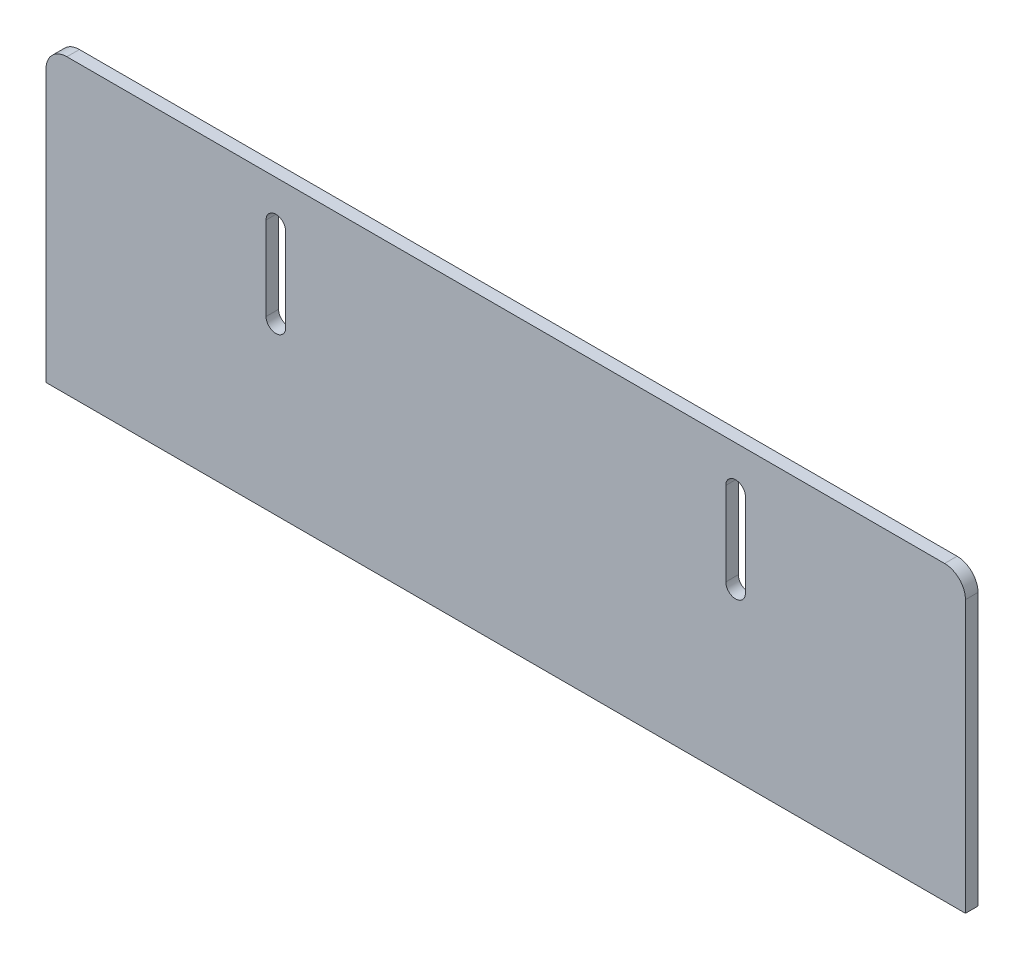
ISO-10303-21;
HEADER;
FILE_DESCRIPTION(('STEP AP214'),'2;1');
FILE_NAME('part.step','',(''),(''),'','','');
FILE_SCHEMA(('AUTOMOTIVE_DESIGN { 1 0 10303 214 1 1 1 1 }'));
ENDSEC;
DATA;
#1=APPLICATION_CONTEXT('core data for automotive mechanical design processes');
#2=APPLICATION_PROTOCOL_DEFINITION('international standard','automotive_design',2000,#1);
#3=PRODUCT_CONTEXT('',#1,'mechanical');
#4=PRODUCT('Part','Part','',(#3));
#5=PRODUCT_RELATED_PRODUCT_CATEGORY('part','',(#4));
#6=PRODUCT_DEFINITION_FORMATION('','',#4);
#7=PRODUCT_DEFINITION_CONTEXT('part definition',#1,'design');
#8=PRODUCT_DEFINITION('design','',#6,#7);
#9=PRODUCT_DEFINITION_SHAPE('','',#8);
#10=(LENGTH_UNIT() NAMED_UNIT(*) SI_UNIT(.MILLI.,.METRE.));
#11=(NAMED_UNIT(*) PLANE_ANGLE_UNIT() SI_UNIT($,.RADIAN.));
#12=(NAMED_UNIT(*) SI_UNIT($,.STERADIAN.) SOLID_ANGLE_UNIT());
#13=UNCERTAINTY_MEASURE_WITH_UNIT(LENGTH_MEASURE(1.E-05),#10,'distance_accuracy_value','');
#14=(GEOMETRIC_REPRESENTATION_CONTEXT(3) GLOBAL_UNCERTAINTY_ASSIGNED_CONTEXT((#13)) GLOBAL_UNIT_ASSIGNED_CONTEXT((#10,
#11,#12)) REPRESENTATION_CONTEXT('',''));
#15=CARTESIAN_POINT('',(0.,0.,0.));
#16=DIRECTION('',(0.,0.,1.));
#17=DIRECTION('',(1.,0.,0.));
#18=AXIS2_PLACEMENT_3D('',#15,#16,#17);
#19=CARTESIAN_POINT('',(55.,40.,3.));
#20=DIRECTION('',(0.,0.,-1.));
#21=DIRECTION('',(-1.,0.,0.));
#22=AXIS2_PLACEMENT_3D('',#19,#20,#21);
#23=CYLINDRICAL_SURFACE('',#22,2.35101433519541);
#24=CARTESIAN_POINT('',(55.,40.,0.));
#25=DIRECTION('',(0.,0.,1.));
#26=DIRECTION('',(1.,0.,0.));
#27=AXIS2_PLACEMENT_3D('',#24,#25,#26);
#28=CIRCLE('',#27,2.35101433519541);
#29=CARTESIAN_POINT('',(52.6489856648046,40.,0.));
#30=VERTEX_POINT('',#29);
#31=CARTESIAN_POINT('',(57.3510143351954,40.,0.));
#32=VERTEX_POINT('',#31);
#33=EDGE_CURVE('E197',#30,#32,#28,.T.);
#34=ORIENTED_EDGE('',*,*,#33,.F.);
#35=DIRECTION('',(0.,0.,-1.));
#36=VECTOR('',#35,1.);
#37=CARTESIAN_POINT('',(52.6489856648046,40.,3.));
#38=LINE('',#37,#36);
#39=CARTESIAN_POINT('',(52.6489856648046,40.,3.));
#40=VERTEX_POINT('',#39);
#41=EDGE_CURVE('E11',#40,#30,#38,.T.);
#42=ORIENTED_EDGE('',*,*,#41,.F.);
#43=CARTESIAN_POINT('',(55.,40.,3.));
#44=DIRECTION('',(0.,0.,1.));
#45=DIRECTION('',(1.,0.,0.));
#46=AXIS2_PLACEMENT_3D('',#43,#44,#45);
#47=CIRCLE('',#46,2.35101433519541);
#48=CARTESIAN_POINT('',(57.3510143351954,40.,3.));
#49=VERTEX_POINT('',#48);
#50=EDGE_CURVE('E161',#40,#49,#47,.T.);
#51=ORIENTED_EDGE('',*,*,#50,.T.);
#52=DIRECTION('',(0.,0.,-1.));
#53=VECTOR('',#52,1.);
#54=CARTESIAN_POINT('',(57.3510143351954,40.,3.));
#55=LINE('',#54,#53);
#56=EDGE_CURVE('E108',#49,#32,#55,.T.);
#57=ORIENTED_EDGE('',*,*,#56,.T.);
#58=EDGE_LOOP('',(#34,#42,#51,#57));
#59=FACE_BOUND('',#58,.T.);
#60=ADVANCED_FACE('F37',(#59),#23,.F.);
#61=CARTESIAN_POINT('',(52.6489856648046,0.,3.));
#62=DIRECTION('',(1.,0.,0.));
#63=DIRECTION('',(0.,0.,-1.));
#64=AXIS2_PLACEMENT_3D('',#61,#62,#63);
#65=PLANE('',#64);
#66=DIRECTION('',(0.,-1.,0.));
#67=VECTOR('',#66,1.);
#68=CARTESIAN_POINT('',(52.6489856648046,0.,0.));
#69=LINE('',#68,#67);
#70=CARTESIAN_POINT('',(52.6489856648046,60.,0.));
#71=VERTEX_POINT('',#70);
#72=EDGE_CURVE('E153',#71,#30,#69,.T.);
#73=ORIENTED_EDGE('',*,*,#72,.F.);
#74=DIRECTION('',(0.,0.,-1.));
#75=VECTOR('',#74,1.);
#76=CARTESIAN_POINT('',(52.6489856648046,60.,3.));
#77=LINE('',#76,#75);
#78=CARTESIAN_POINT('',(52.6489856648046,60.,3.));
#79=VERTEX_POINT('',#78);
#80=EDGE_CURVE('E47',#79,#71,#77,.T.);
#81=ORIENTED_EDGE('',*,*,#80,.F.);
#82=DIRECTION('',(0.,-1.,0.));
#83=VECTOR('',#82,1.);
#84=CARTESIAN_POINT('',(52.6489856648046,0.,3.));
#85=LINE('',#84,#83);
#86=EDGE_CURVE('E151',#79,#40,#85,.T.);
#87=ORIENTED_EDGE('',*,*,#86,.T.);
#88=ORIENTED_EDGE('',*,*,#41,.T.);
#89=EDGE_LOOP('',(#73,#81,#87,#88));
#90=FACE_BOUND('',#89,.T.);
#91=ADVANCED_FACE('F150',(#90),#65,.T.);
#92=CARTESIAN_POINT('',(55.,60.,3.));
#93=DIRECTION('',(0.,0.,-1.));
#94=DIRECTION('',(-1.,0.,0.));
#95=AXIS2_PLACEMENT_3D('',#92,#93,#94);
#96=CYLINDRICAL_SURFACE('',#95,2.35101433519541);
#97=CARTESIAN_POINT('',(55.,60.,0.));
#98=DIRECTION('',(0.,0.,1.));
#99=DIRECTION('',(1.,0.,0.));
#100=AXIS2_PLACEMENT_3D('',#97,#98,#99);
#101=CIRCLE('',#100,2.35101433519541);
#102=CARTESIAN_POINT('',(57.3510143351954,60.,0.));
#103=VERTEX_POINT('',#102);
#104=EDGE_CURVE('E201',#103,#71,#101,.T.);
#105=ORIENTED_EDGE('',*,*,#104,.F.);
#106=DIRECTION('',(0.,0.,-1.));
#107=VECTOR('',#106,1.);
#108=CARTESIAN_POINT('',(57.3510143351954,60.,3.));
#109=LINE('',#108,#107);
#110=CARTESIAN_POINT('',(57.3510143351954,60.,3.));
#111=VERTEX_POINT('',#110);
#112=EDGE_CURVE('E101',#111,#103,#109,.T.);
#113=ORIENTED_EDGE('',*,*,#112,.F.);
#114=CARTESIAN_POINT('',(55.,60.,3.));
#115=DIRECTION('',(0.,0.,1.));
#116=DIRECTION('',(1.,0.,0.));
#117=AXIS2_PLACEMENT_3D('',#114,#115,#116);
#118=CIRCLE('',#117,2.35101433519541);
#119=EDGE_CURVE('E160',#111,#79,#118,.T.);
#120=ORIENTED_EDGE('',*,*,#119,.T.);
#121=ORIENTED_EDGE('',*,*,#80,.T.);
#122=EDGE_LOOP('',(#105,#113,#120,#121));
#123=FACE_BOUND('',#122,.T.);
#124=ADVANCED_FACE('F163',(#123),#96,.F.);
#125=CARTESIAN_POINT('',(0.,70.,3.));
#126=DIRECTION('',(0.,1.,0.));
#127=DIRECTION('',(-1.,0.,0.));
#128=AXIS2_PLACEMENT_3D('',#125,#126,#127);
#129=PLANE('',#128);
#130=DIRECTION('',(1.,0.,0.));
#131=VECTOR('',#130,1.);
#132=CARTESIAN_POINT('',(0.,70.,0.));
#133=LINE('',#132,#131);
#134=CARTESIAN_POINT('',(4.99999999999998,70.,0.));
#135=VERTEX_POINT('',#134);
#136=CARTESIAN_POINT('',(215.,70.,0.));
#137=VERTEX_POINT('',#136);
#138=EDGE_CURVE('E179',#135,#137,#133,.T.);
#139=ORIENTED_EDGE('',*,*,#138,.F.);
#140=DIRECTION('',(0.,0.,-1.));
#141=VECTOR('',#140,1.);
#142=CARTESIAN_POINT('',(4.99999999999998,70.,3.));
#143=LINE('',#142,#141);
#144=CARTESIAN_POINT('',(4.99999999999998,70.,3.));
#145=VERTEX_POINT('',#144);
#146=EDGE_CURVE('E207',#145,#135,#143,.T.);
#147=ORIENTED_EDGE('',*,*,#146,.F.);
#148=DIRECTION('',(1.,0.,0.));
#149=VECTOR('',#148,1.);
#150=CARTESIAN_POINT('',(0.,70.,3.));
#151=LINE('',#150,#149);
#152=CARTESIAN_POINT('',(215.,70.,3.));
#153=VERTEX_POINT('',#152);
#154=EDGE_CURVE('E250',#145,#153,#151,.T.);
#155=ORIENTED_EDGE('',*,*,#154,.T.);
#156=DIRECTION('',(0.,0.,-1.));
#157=VECTOR('',#156,1.);
#158=CARTESIAN_POINT('',(215.,70.,3.));
#159=LINE('',#158,#157);
#160=EDGE_CURVE('E209',#153,#137,#159,.T.);
#161=ORIENTED_EDGE('',*,*,#160,.T.);
#162=EDGE_LOOP('',(#139,#147,#155,#161));
#163=FACE_BOUND('',#162,.T.);
#164=ADVANCED_FACE('F308',(#163),#129,.T.);
#165=CARTESIAN_POINT('',(4.99999999999998,65.,3.));
#166=DIRECTION('',(0.,0.,-1.));
#167=DIRECTION('',(-1.,0.,0.));
#168=AXIS2_PLACEMENT_3D('',#165,#166,#167);
#169=CYLINDRICAL_SURFACE('',#168,4.99999999999999);
#170=CARTESIAN_POINT('',(4.99999999999998,65.,0.));
#171=DIRECTION('',(0.,0.,1.));
#172=DIRECTION('',(1.,0.,0.));
#173=AXIS2_PLACEMENT_3D('',#170,#171,#172);
#174=CIRCLE('',#173,4.99999999999999);
#175=CARTESIAN_POINT('',(0.,65.,0.));
#176=VERTEX_POINT('',#175);
#177=EDGE_CURVE('E182',#176,#135,#174,.F.);
#178=ORIENTED_EDGE('',*,*,#177,.F.);
#179=DIRECTION('',(0.,0.,-1.));
#180=VECTOR('',#179,1.);
#181=CARTESIAN_POINT('',(0.,65.,3.));
#182=LINE('',#181,#180);
#183=CARTESIAN_POINT('',(0.,65.,3.));
#184=VERTEX_POINT('',#183);
#185=EDGE_CURVE('E219',#184,#176,#182,.T.);
#186=ORIENTED_EDGE('',*,*,#185,.F.);
#187=CARTESIAN_POINT('',(4.99999999999998,65.,3.));
#188=DIRECTION('',(0.,0.,1.));
#189=DIRECTION('',(1.,0.,0.));
#190=AXIS2_PLACEMENT_3D('',#187,#188,#189);
#191=CIRCLE('',#190,4.99999999999999);
#192=EDGE_CURVE('E257',#184,#145,#191,.F.);
#193=ORIENTED_EDGE('',*,*,#192,.T.);
#194=ORIENTED_EDGE('',*,*,#146,.T.);
#195=EDGE_LOOP('',(#178,#186,#193,#194));
#196=FACE_BOUND('',#195,.T.);
#197=ADVANCED_FACE('F304',(#196),#169,.T.);
#198=CARTESIAN_POINT('',(0.,0.,3.));
#199=DIRECTION('',(-1.,0.,0.));
#200=DIRECTION('',(0.,0.,1.));
#201=AXIS2_PLACEMENT_3D('',#198,#199,#200);
#202=PLANE('',#201);
#203=DIRECTION('',(0.,1.,0.));
#204=VECTOR('',#203,1.);
#205=CARTESIAN_POINT('',(0.,0.,0.));
#206=LINE('',#205,#204);
#207=CARTESIAN_POINT('',(0.,0.,0.));
#208=VERTEX_POINT('',#207);
#209=EDGE_CURVE('E185',#208,#176,#206,.T.);
#210=ORIENTED_EDGE('',*,*,#209,.F.);
#211=DIRECTION('',(0.,0.,-1.));
#212=VECTOR('',#211,1.);
#213=CARTESIAN_POINT('',(0.,0.,3.));
#214=LINE('',#213,#212);
#215=CARTESIAN_POINT('',(0.,0.,3.));
#216=VERTEX_POINT('',#215);
#217=EDGE_CURVE('E217',#216,#208,#214,.T.);
#218=ORIENTED_EDGE('',*,*,#217,.F.);
#219=DIRECTION('',(0.,1.,0.));
#220=VECTOR('',#219,1.);
#221=CARTESIAN_POINT('',(0.,0.,3.));
#222=LINE('',#221,#220);
#223=EDGE_CURVE('E260',#216,#184,#222,.T.);
#224=ORIENTED_EDGE('',*,*,#223,.T.);
#225=ORIENTED_EDGE('',*,*,#185,.T.);
#226=EDGE_LOOP('',(#210,#218,#224,#225));
#227=FACE_BOUND('',#226,.T.);
#228=ADVANCED_FACE('F300',(#227),#202,.T.);
#229=CARTESIAN_POINT('',(0.,0.,3.));
#230=DIRECTION('',(0.,1.,0.));
#231=DIRECTION('',(-1.,0.,0.));
#232=AXIS2_PLACEMENT_3D('',#229,#230,#231);
#233=PLANE('',#232);
#234=DIRECTION('',(1.,0.,0.));
#235=VECTOR('',#234,1.);
#236=CARTESIAN_POINT('',(0.,0.,0.));
#237=LINE('',#236,#235);
#238=CARTESIAN_POINT('',(220.,0.,0.));
#239=VERTEX_POINT('',#238);
#240=EDGE_CURVE('E188',#208,#239,#237,.T.);
#241=ORIENTED_EDGE('',*,*,#240,.T.);
#242=DIRECTION('',(0.,0.,-1.));
#243=VECTOR('',#242,1.);
#244=CARTESIAN_POINT('',(220.,0.,3.));
#245=LINE('',#244,#243);
#246=CARTESIAN_POINT('',(220.,0.,3.));
#247=VERTEX_POINT('',#246);
#248=EDGE_CURVE('E214',#247,#239,#245,.T.);
#249=ORIENTED_EDGE('',*,*,#248,.F.);
#250=DIRECTION('',(1.,0.,0.));
#251=VECTOR('',#250,1.);
#252=CARTESIAN_POINT('',(0.,0.,3.));
#253=LINE('',#252,#251);
#254=EDGE_CURVE('E263',#216,#247,#253,.T.);
#255=ORIENTED_EDGE('',*,*,#254,.F.);
#256=ORIENTED_EDGE('',*,*,#217,.T.);
#257=EDGE_LOOP('',(#241,#249,#255,#256));
#258=FACE_BOUND('',#257,.T.);
#259=ADVANCED_FACE('F296',(#258),#233,.F.);
#260=CARTESIAN_POINT('',(220.,0.,3.));
#261=DIRECTION('',(-1.,0.,0.));
#262=DIRECTION('',(0.,-1.,0.));
#263=AXIS2_PLACEMENT_3D('',#260,#261,#262);
#264=PLANE('',#263);
#265=DIRECTION('',(0.,1.,0.));
#266=VECTOR('',#265,1.);
#267=CARTESIAN_POINT('',(220.,0.,0.));
#268=LINE('',#267,#266);
#269=CARTESIAN_POINT('',(220.,65.,0.));
#270=VERTEX_POINT('',#269);
#271=EDGE_CURVE('E191',#239,#270,#268,.T.);
#272=ORIENTED_EDGE('',*,*,#271,.T.);
#273=DIRECTION('',(0.,0.,-1.));
#274=VECTOR('',#273,1.);
#275=CARTESIAN_POINT('',(220.,65.,3.));
#276=LINE('',#275,#274);
#277=CARTESIAN_POINT('',(220.,65.,3.));
#278=VERTEX_POINT('',#277);
#279=EDGE_CURVE('E211',#278,#270,#276,.T.);
#280=ORIENTED_EDGE('',*,*,#279,.F.);
#281=DIRECTION('',(0.,1.,0.));
#282=VECTOR('',#281,1.);
#283=CARTESIAN_POINT('',(220.,0.,3.));
#284=LINE('',#283,#282);
#285=EDGE_CURVE('E266',#247,#278,#284,.T.);
#286=ORIENTED_EDGE('',*,*,#285,.F.);
#287=ORIENTED_EDGE('',*,*,#248,.T.);
#288=EDGE_LOOP('',(#272,#280,#286,#287));
#289=FACE_BOUND('',#288,.T.);
#290=ADVANCED_FACE('F293',(#289),#264,.F.);
#291=CARTESIAN_POINT('',(162.648985664805,0.,3.));
#292=DIRECTION('',(1.,0.,0.));
#293=DIRECTION('',(0.,0.,-1.));
#294=AXIS2_PLACEMENT_3D('',#291,#292,#293);
#295=PLANE('',#294);
#296=DIRECTION('',(0.,-1.,0.));
#297=VECTOR('',#296,1.);
#298=CARTESIAN_POINT('',(162.648985664805,0.,0.));
#299=LINE('',#298,#297);
#300=CARTESIAN_POINT('',(162.648985664805,60.,0.));
#301=VERTEX_POINT('',#300);
#302=CARTESIAN_POINT('',(162.648985664805,40.,0.));
#303=VERTEX_POINT('',#302);
#304=EDGE_CURVE('E169',#301,#303,#299,.T.);
#305=ORIENTED_EDGE('',*,*,#304,.F.);
#306=DIRECTION('',(0.,0.,-1.));
#307=VECTOR('',#306,1.);
#308=CARTESIAN_POINT('',(162.648985664805,60.,3.));
#309=LINE('',#308,#307);
#310=CARTESIAN_POINT('',(162.648985664805,60.,3.));
#311=VERTEX_POINT('',#310);
#312=EDGE_CURVE('E41',#311,#301,#309,.T.);
#313=ORIENTED_EDGE('',*,*,#312,.F.);
#314=DIRECTION('',(0.,-1.,0.));
#315=VECTOR('',#314,1.);
#316=CARTESIAN_POINT('',(162.648985664805,0.,3.));
#317=LINE('',#316,#315);
#318=CARTESIAN_POINT('',(162.648985664805,40.,3.));
#319=VERTEX_POINT('',#318);
#320=EDGE_CURVE('E205',#311,#319,#317,.T.);
#321=ORIENTED_EDGE('',*,*,#320,.T.);
#322=DIRECTION('',(0.,0.,-1.));
#323=VECTOR('',#322,1.);
#324=CARTESIAN_POINT('',(162.648985664805,40.,3.));
#325=LINE('',#324,#323);
#326=EDGE_CURVE('E165',#319,#303,#325,.T.);
#327=ORIENTED_EDGE('',*,*,#326,.T.);
#328=EDGE_LOOP('',(#305,#313,#321,#327));
#329=FACE_BOUND('',#328,.T.);
#330=ADVANCED_FACE('F39',(#329),#295,.T.);
#331=CARTESIAN_POINT('',(165.,60.,3.));
#332=DIRECTION('',(0.,0.,-1.));
#333=DIRECTION('',(-1.,0.,0.));
#334=AXIS2_PLACEMENT_3D('',#331,#332,#333);
#335=CYLINDRICAL_SURFACE('',#334,2.35101433519541);
#336=CARTESIAN_POINT('',(165.,60.,0.));
#337=DIRECTION('',(0.,0.,1.));
#338=DIRECTION('',(1.,0.,0.));
#339=AXIS2_PLACEMENT_3D('',#336,#337,#338);
#340=CIRCLE('',#339,2.35101433519541);
#341=CARTESIAN_POINT('',(167.351014335195,60.,0.));
#342=VERTEX_POINT('',#341);
#343=EDGE_CURVE('E172',#301,#342,#340,.F.);
#344=ORIENTED_EDGE('',*,*,#343,.T.);
#345=DIRECTION('',(0.,0.,-1.));
#346=VECTOR('',#345,1.);
#347=CARTESIAN_POINT('',(167.351014335195,60.,3.));
#348=LINE('',#347,#346);
#349=CARTESIAN_POINT('',(167.351014335195,60.,3.));
#350=VERTEX_POINT('',#349);
#351=EDGE_CURVE('E225',#350,#342,#348,.T.);
#352=ORIENTED_EDGE('',*,*,#351,.F.);
#353=CARTESIAN_POINT('',(165.,60.,3.));
#354=DIRECTION('',(0.,0.,1.));
#355=DIRECTION('',(1.,0.,0.));
#356=AXIS2_PLACEMENT_3D('',#353,#354,#355);
#357=CIRCLE('',#356,2.35101433519541);
#358=EDGE_CURVE('E234',#311,#350,#357,.F.);
#359=ORIENTED_EDGE('',*,*,#358,.F.);
#360=ORIENTED_EDGE('',*,*,#312,.T.);
#361=EDGE_LOOP('',(#344,#352,#359,#360));
#362=FACE_BOUND('',#361,.T.);
#363=ADVANCED_FACE('F233',(#362),#335,.F.);
#364=CARTESIAN_POINT('',(167.351014335195,0.,3.));
#365=DIRECTION('',(1.,0.,0.));
#366=DIRECTION('',(0.,0.,-1.));
#367=AXIS2_PLACEMENT_3D('',#364,#365,#366);
#368=PLANE('',#367);
#369=DIRECTION('',(0.,-1.,0.));
#370=VECTOR('',#369,1.);
#371=CARTESIAN_POINT('',(167.351014335195,0.,0.));
#372=LINE('',#371,#370);
#373=CARTESIAN_POINT('',(167.351014335195,40.,0.));
#374=VERTEX_POINT('',#373);
#375=EDGE_CURVE('E174',#342,#374,#372,.T.);
#376=ORIENTED_EDGE('',*,*,#375,.T.);
#377=DIRECTION('',(0.,0.,-1.));
#378=VECTOR('',#377,1.);
#379=CARTESIAN_POINT('',(167.351014335195,40.,3.));
#380=LINE('',#379,#378);
#381=CARTESIAN_POINT('',(167.351014335195,40.,3.));
#382=VERTEX_POINT('',#381);
#383=EDGE_CURVE('E223',#382,#374,#380,.T.);
#384=ORIENTED_EDGE('',*,*,#383,.F.);
#385=DIRECTION('',(0.,-1.,0.));
#386=VECTOR('',#385,1.);
#387=CARTESIAN_POINT('',(167.351014335195,0.,3.));
#388=LINE('',#387,#386);
#389=EDGE_CURVE('E247',#350,#382,#388,.T.);
#390=ORIENTED_EDGE('',*,*,#389,.F.);
#391=ORIENTED_EDGE('',*,*,#351,.T.);
#392=EDGE_LOOP('',(#376,#384,#390,#391));
#393=FACE_BOUND('',#392,.T.);
#394=ADVANCED_FACE('F246',(#393),#368,.F.);
#395=CARTESIAN_POINT('',(215.,65.,3.));
#396=DIRECTION('',(0.,0.,-1.));
#397=DIRECTION('',(-1.,0.,0.));
#398=AXIS2_PLACEMENT_3D('',#395,#396,#397);
#399=CYLINDRICAL_SURFACE('',#398,4.99999999999999);
#400=CARTESIAN_POINT('',(215.,65.,0.));
#401=DIRECTION('',(0.,0.,1.));
#402=DIRECTION('',(1.,0.,0.));
#403=AXIS2_PLACEMENT_3D('',#400,#401,#402);
#404=CIRCLE('',#403,4.99999999999999);
#405=EDGE_CURVE('E194',#270,#137,#404,.T.);
#406=ORIENTED_EDGE('',*,*,#405,.T.);
#407=ORIENTED_EDGE('',*,*,#160,.F.);
#408=CARTESIAN_POINT('',(215.,65.,3.));
#409=DIRECTION('',(0.,0.,1.));
#410=DIRECTION('',(1.,0.,0.));
#411=AXIS2_PLACEMENT_3D('',#408,#409,#410);
#412=CIRCLE('',#411,4.99999999999999);
#413=EDGE_CURVE('E269',#278,#153,#412,.T.);
#414=ORIENTED_EDGE('',*,*,#413,.F.);
#415=ORIENTED_EDGE('',*,*,#279,.T.);
#416=EDGE_LOOP('',(#406,#407,#414,#415));
#417=FACE_BOUND('',#416,.T.);
#418=ADVANCED_FACE('F279',(#417),#399,.T.);
#419=CARTESIAN_POINT('',(165.,40.,3.));
#420=DIRECTION('',(0.,0.,-1.));
#421=DIRECTION('',(-1.,0.,0.));
#422=AXIS2_PLACEMENT_3D('',#419,#420,#421);
#423=CYLINDRICAL_SURFACE('',#422,2.35101433519541);
#424=CARTESIAN_POINT('',(165.,40.,0.));
#425=DIRECTION('',(0.,0.,1.));
#426=DIRECTION('',(1.,0.,0.));
#427=AXIS2_PLACEMENT_3D('',#424,#425,#426);
#428=CIRCLE('',#427,2.35101433519541);
#429=EDGE_CURVE('E176',#374,#303,#428,.F.);
#430=ORIENTED_EDGE('',*,*,#429,.T.);
#431=ORIENTED_EDGE('',*,*,#326,.F.);
#432=CARTESIAN_POINT('',(165.,40.,3.));
#433=DIRECTION('',(0.,0.,1.));
#434=DIRECTION('',(1.,0.,0.));
#435=AXIS2_PLACEMENT_3D('',#432,#433,#434);
#436=CIRCLE('',#435,2.35101433519541);
#437=EDGE_CURVE('E245',#382,#319,#436,.F.);
#438=ORIENTED_EDGE('',*,*,#437,.F.);
#439=ORIENTED_EDGE('',*,*,#383,.T.);
#440=EDGE_LOOP('',(#430,#431,#438,#439));
#441=FACE_BOUND('',#440,.T.);
#442=ADVANCED_FACE('F243',(#441),#423,.F.);
#443=CARTESIAN_POINT('',(57.3510143351954,0.,3.));
#444=DIRECTION('',(1.,0.,0.));
#445=DIRECTION('',(0.,1.,0.));
#446=AXIS2_PLACEMENT_3D('',#443,#444,#445);
#447=PLANE('',#446);
#448=DIRECTION('',(0.,-1.,0.));
#449=VECTOR('',#448,1.);
#450=CARTESIAN_POINT('',(57.3510143351954,0.,0.));
#451=LINE('',#450,#449);
#452=EDGE_CURVE('E203',#103,#32,#451,.T.);
#453=ORIENTED_EDGE('',*,*,#452,.T.);
#454=ORIENTED_EDGE('',*,*,#56,.F.);
#455=DIRECTION('',(0.,-1.,0.));
#456=VECTOR('',#455,1.);
#457=CARTESIAN_POINT('',(57.3510143351954,0.,3.));
#458=LINE('',#457,#456);
#459=EDGE_CURVE('E56',#111,#49,#458,.T.);
#460=ORIENTED_EDGE('',*,*,#459,.F.);
#461=ORIENTED_EDGE('',*,*,#112,.T.);
#462=EDGE_LOOP('',(#453,#454,#460,#461));
#463=FACE_BOUND('',#462,.T.);
#464=ADVANCED_FACE('F271',(#463),#447,.F.);
#465=CARTESIAN_POINT('',(0.,0.,3.));
#466=DIRECTION('',(0.,0.,1.));
#467=DIRECTION('',(1.,0.,0.));
#468=AXIS2_PLACEMENT_3D('',#465,#466,#467);
#469=PLANE('',#468);
#470=ORIENTED_EDGE('',*,*,#320,.F.);
#471=ORIENTED_EDGE('',*,*,#358,.T.);
#472=ORIENTED_EDGE('',*,*,#389,.T.);
#473=ORIENTED_EDGE('',*,*,#437,.T.);
#474=EDGE_LOOP('',(#470,#471,#472,#473));
#475=FACE_BOUND('',#474,.T.);
#476=ORIENTED_EDGE('',*,*,#154,.F.);
#477=ORIENTED_EDGE('',*,*,#192,.F.);
#478=ORIENTED_EDGE('',*,*,#223,.F.);
#479=ORIENTED_EDGE('',*,*,#254,.T.);
#480=ORIENTED_EDGE('',*,*,#285,.T.);
#481=ORIENTED_EDGE('',*,*,#413,.T.);
#482=EDGE_LOOP('',(#476,#477,#478,#479,#480,#481));
#483=FACE_BOUND('',#482,.T.);
#484=ORIENTED_EDGE('',*,*,#50,.F.);
#485=ORIENTED_EDGE('',*,*,#86,.F.);
#486=ORIENTED_EDGE('',*,*,#119,.F.);
#487=ORIENTED_EDGE('',*,*,#459,.T.);
#488=EDGE_LOOP('',(#484,#485,#486,#487));
#489=FACE_BOUND('',#488,.T.);
#490=ADVANCED_FACE('F159',(#475,#483,#489),#469,.T.);
#491=CARTESIAN_POINT('',(0.,0.,0.));
#492=DIRECTION('',(0.,0.,1.));
#493=DIRECTION('',(1.,0.,0.));
#494=AXIS2_PLACEMENT_3D('',#491,#492,#493);
#495=PLANE('',#494);
#496=ORIENTED_EDGE('',*,*,#304,.T.);
#497=ORIENTED_EDGE('',*,*,#429,.F.);
#498=ORIENTED_EDGE('',*,*,#375,.F.);
#499=ORIENTED_EDGE('',*,*,#343,.F.);
#500=EDGE_LOOP('',(#496,#497,#498,#499));
#501=FACE_BOUND('',#500,.T.);
#502=ORIENTED_EDGE('',*,*,#138,.T.);
#503=ORIENTED_EDGE('',*,*,#405,.F.);
#504=ORIENTED_EDGE('',*,*,#271,.F.);
#505=ORIENTED_EDGE('',*,*,#240,.F.);
#506=ORIENTED_EDGE('',*,*,#209,.T.);
#507=ORIENTED_EDGE('',*,*,#177,.T.);
#508=EDGE_LOOP('',(#502,#503,#504,#505,#506,#507));
#509=FACE_BOUND('',#508,.T.);
#510=ORIENTED_EDGE('',*,*,#33,.T.);
#511=ORIENTED_EDGE('',*,*,#452,.F.);
#512=ORIENTED_EDGE('',*,*,#104,.T.);
#513=ORIENTED_EDGE('',*,*,#72,.T.);
#514=EDGE_LOOP('',(#510,#511,#512,#513));
#515=FACE_BOUND('',#514,.T.);
#516=ADVANCED_FACE('F237',(#501,#509,#515),#495,.F.);
#517=CLOSED_SHELL('',(#60,#91,#124,#164,#197,#228,#259,#290,#330,#363,#394,#418,#442,#464,#490,#516));
#518=MANIFOLD_SOLID_BREP('B2',#517);
#519=ADVANCED_BREP_SHAPE_REPRESENTATION('',(#18,#518),#14);
#520=SHAPE_DEFINITION_REPRESENTATION(#9,#519);
ENDSEC;
END-ISO-10303-21;
